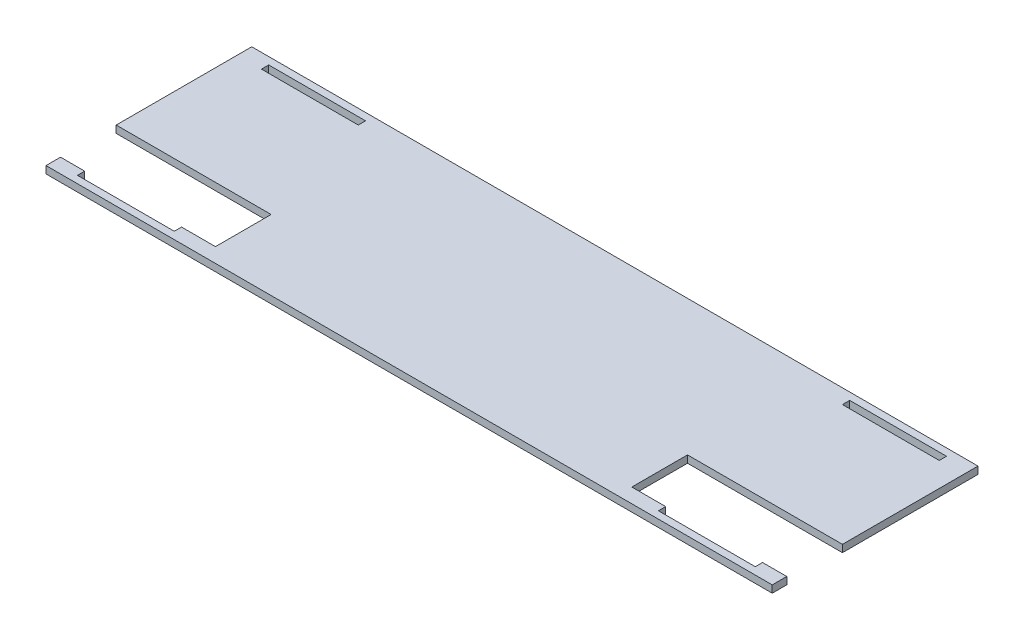
ISO-10303-21;
HEADER;
FILE_DESCRIPTION(('STEP AP214'),'2;1');
FILE_NAME('part.step','',(''),(''),'','','');
FILE_SCHEMA(('AUTOMOTIVE_DESIGN { 1 0 10303 214 1 1 1 1 }'));
ENDSEC;
DATA;
#1=APPLICATION_CONTEXT('core data for automotive mechanical design processes');
#2=APPLICATION_PROTOCOL_DEFINITION('international standard','automotive_design',2000,#1);
#3=PRODUCT_CONTEXT('',#1,'mechanical');
#4=PRODUCT('Part','Part','',(#3));
#5=PRODUCT_RELATED_PRODUCT_CATEGORY('part','',(#4));
#6=PRODUCT_DEFINITION_FORMATION('','',#4);
#7=PRODUCT_DEFINITION_CONTEXT('part definition',#1,'design');
#8=PRODUCT_DEFINITION('design','',#6,#7);
#9=PRODUCT_DEFINITION_SHAPE('','',#8);
#10=(LENGTH_UNIT() NAMED_UNIT(*) SI_UNIT(.MILLI.,.METRE.));
#11=(NAMED_UNIT(*) PLANE_ANGLE_UNIT() SI_UNIT($,.RADIAN.));
#12=(NAMED_UNIT(*) SI_UNIT($,.STERADIAN.) SOLID_ANGLE_UNIT());
#13=UNCERTAINTY_MEASURE_WITH_UNIT(LENGTH_MEASURE(1.E-05),#10,'distance_accuracy_value','');
#14=(GEOMETRIC_REPRESENTATION_CONTEXT(3) GLOBAL_UNCERTAINTY_ASSIGNED_CONTEXT((#13)) GLOBAL_UNIT_ASSIGNED_CONTEXT((#10,
#11,#12)) REPRESENTATION_CONTEXT('',''));
#15=CARTESIAN_POINT('',(0.,0.,0.));
#16=DIRECTION('',(0.,0.,1.));
#17=DIRECTION('',(1.,0.,0.));
#18=AXIS2_PLACEMENT_3D('',#15,#16,#17);
#19=CARTESIAN_POINT('',(0.,3.,0.));
#20=DIRECTION('',(-1.,0.,0.));
#21=DIRECTION('',(0.,0.,1.));
#22=AXIS2_PLACEMENT_3D('',#19,#20,#21);
#23=PLANE('',#22);
#24=DIRECTION('',(0.,0.,-1.));
#25=VECTOR('',#24,1.);
#26=CARTESIAN_POINT('',(0.,3.,0.));
#27=LINE('',#26,#25);
#28=CARTESIAN_POINT('',(0.,3.,-29.));
#29=VERTEX_POINT('',#28);
#30=CARTESIAN_POINT('',(0.,3.,-85.));
#31=VERTEX_POINT('',#30);
#32=EDGE_CURVE('E404',#29,#31,#27,.T.);
#33=ORIENTED_EDGE('',*,*,#32,.F.);
#34=DIRECTION('',(0.,1.,0.));
#35=VECTOR('',#34,1.);
#36=CARTESIAN_POINT('',(0.,0.,-29.));
#37=LINE('',#36,#35);
#38=CARTESIAN_POINT('',(0.,0.,-29.));
#39=VERTEX_POINT('',#38);
#40=EDGE_CURVE('E257',#39,#29,#37,.T.);
#41=ORIENTED_EDGE('',*,*,#40,.F.);
#42=DIRECTION('',(0.,0.,-1.));
#43=VECTOR('',#42,1.);
#44=CARTESIAN_POINT('',(0.,0.,0.));
#45=LINE('',#44,#43);
#46=CARTESIAN_POINT('',(0.,0.,-85.));
#47=VERTEX_POINT('',#46);
#48=EDGE_CURVE('E393',#39,#47,#45,.T.);
#49=ORIENTED_EDGE('',*,*,#48,.T.);
#50=DIRECTION('',(0.,-1.,0.));
#51=VECTOR('',#50,1.);
#52=CARTESIAN_POINT('',(0.,3.,-85.));
#53=LINE('',#52,#51);
#54=EDGE_CURVE('E11',#31,#47,#53,.T.);
#55=ORIENTED_EDGE('',*,*,#54,.F.);
#56=EDGE_LOOP('',(#33,#41,#49,#55));
#57=FACE_BOUND('',#56,.T.);
#58=ADVANCED_FACE('F33',(#57),#23,.F.);
#59=CARTESIAN_POINT('',(-300.,3.,0.));
#60=DIRECTION('',(1.,0.,0.));
#61=DIRECTION('',(0.,0.,-1.));
#62=AXIS2_PLACEMENT_3D('',#59,#60,#61);
#63=PLANE('',#62);
#64=DIRECTION('',(0.,0.,1.));
#65=VECTOR('',#64,1.);
#66=CARTESIAN_POINT('',(-300.,0.,0.));
#67=LINE('',#66,#65);
#68=CARTESIAN_POINT('',(-300.,0.,-85.));
#69=VERTEX_POINT('',#68);
#70=CARTESIAN_POINT('',(-300.,0.,-29.));
#71=VERTEX_POINT('',#70);
#72=EDGE_CURVE('E419',#69,#71,#67,.T.);
#73=ORIENTED_EDGE('',*,*,#72,.T.);
#74=DIRECTION('',(0.,1.,0.));
#75=VECTOR('',#74,1.);
#76=CARTESIAN_POINT('',(-300.,0.,-29.));
#77=LINE('',#76,#75);
#78=CARTESIAN_POINT('',(-300.,3.,-29.));
#79=VERTEX_POINT('',#78);
#80=EDGE_CURVE('E279',#71,#79,#77,.T.);
#81=ORIENTED_EDGE('',*,*,#80,.T.);
#82=DIRECTION('',(0.,0.,1.));
#83=VECTOR('',#82,1.);
#84=CARTESIAN_POINT('',(-300.,3.,0.));
#85=LINE('',#84,#83);
#86=CARTESIAN_POINT('',(-300.,3.,-85.));
#87=VERTEX_POINT('',#86);
#88=EDGE_CURVE('E407',#87,#79,#85,.T.);
#89=ORIENTED_EDGE('',*,*,#88,.F.);
#90=DIRECTION('',(0.,-1.,0.));
#91=VECTOR('',#90,1.);
#92=CARTESIAN_POINT('',(-300.,3.,-85.));
#93=LINE('',#92,#91);
#94=EDGE_CURVE('E41',#87,#69,#93,.T.);
#95=ORIENTED_EDGE('',*,*,#94,.T.);
#96=EDGE_LOOP('',(#73,#81,#89,#95));
#97=FACE_BOUND('',#96,.T.);
#98=ADVANCED_FACE('F433',(#97),#63,.F.);
#99=CARTESIAN_POINT('',(0.,0.,0.));
#100=VERTEX_POINT('',#99);
#101=CARTESIAN_POINT('',(0.,0.,-5.99999999999996));
#102=VERTEX_POINT('',#101);
#103=EDGE_CURVE('E413',#100,#102,#45,.T.);
#104=ORIENTED_EDGE('',*,*,#103,.T.);
#105=DIRECTION('',(0.,1.,0.));
#106=VECTOR('',#105,1.);
#107=CARTESIAN_POINT('',(0.,0.,-5.99999999999996));
#108=LINE('',#107,#106);
#109=CARTESIAN_POINT('',(0.,3.,-5.99999999999996));
#110=VERTEX_POINT('',#109);
#111=EDGE_CURVE('E228',#102,#110,#108,.T.);
#112=ORIENTED_EDGE('',*,*,#111,.T.);
#113=CARTESIAN_POINT('',(0.,3.,0.));
#114=VERTEX_POINT('',#113);
#115=EDGE_CURVE('E400',#114,#110,#27,.T.);
#116=ORIENTED_EDGE('',*,*,#115,.F.);
#117=DIRECTION('',(0.,-1.,0.));
#118=VECTOR('',#117,1.);
#119=CARTESIAN_POINT('',(0.,3.,0.));
#120=LINE('',#119,#118);
#121=EDGE_CURVE('E412',#114,#100,#120,.T.);
#122=ORIENTED_EDGE('',*,*,#121,.T.);
#123=EDGE_LOOP('',(#104,#112,#116,#122));
#124=FACE_BOUND('',#123,.T.);
#125=ADVANCED_FACE('F35',(#124),#23,.F.);
#126=CARTESIAN_POINT('',(0.,3.,-85.));
#127=DIRECTION('',(0.,0.,1.));
#128=DIRECTION('',(1.,0.,0.));
#129=AXIS2_PLACEMENT_3D('',#126,#127,#128);
#130=PLANE('',#129);
#131=DIRECTION('',(-1.,0.,0.));
#132=VECTOR('',#131,1.);
#133=CARTESIAN_POINT('',(0.,0.,-85.));
#134=LINE('',#133,#132);
#135=EDGE_CURVE('E416',#47,#69,#134,.T.);
#136=ORIENTED_EDGE('',*,*,#135,.T.);
#137=ORIENTED_EDGE('',*,*,#94,.F.);
#138=DIRECTION('',(-1.,0.,0.));
#139=VECTOR('',#138,1.);
#140=CARTESIAN_POINT('',(0.,3.,-85.));
#141=LINE('',#140,#139);
#142=EDGE_CURVE('E403',#31,#87,#141,.T.);
#143=ORIENTED_EDGE('',*,*,#142,.F.);
#144=ORIENTED_EDGE('',*,*,#54,.T.);
#145=EDGE_LOOP('',(#136,#137,#143,#144));
#146=FACE_BOUND('',#145,.T.);
#147=ADVANCED_FACE('F450',(#146),#130,.F.);
#148=CARTESIAN_POINT('',(-300.,3.,-5.99999999999996));
#149=VERTEX_POINT('',#148);
#150=CARTESIAN_POINT('',(-300.,3.,0.));
#151=VERTEX_POINT('',#150);
#152=EDGE_CURVE('E406',#149,#151,#85,.T.);
#153=ORIENTED_EDGE('',*,*,#152,.F.);
#154=DIRECTION('',(0.,1.,0.));
#155=VECTOR('',#154,1.);
#156=CARTESIAN_POINT('',(-300.,0.,-5.99999999999996));
#157=LINE('',#156,#155);
#158=CARTESIAN_POINT('',(-300.,0.,-5.99999999999996));
#159=VERTEX_POINT('',#158);
#160=EDGE_CURVE('E271',#159,#149,#157,.T.);
#161=ORIENTED_EDGE('',*,*,#160,.F.);
#162=CARTESIAN_POINT('',(-300.,0.,0.));
#163=VERTEX_POINT('',#162);
#164=EDGE_CURVE('E418',#159,#163,#67,.T.);
#165=ORIENTED_EDGE('',*,*,#164,.T.);
#166=DIRECTION('',(0.,-1.,0.));
#167=VECTOR('',#166,1.);
#168=CARTESIAN_POINT('',(-300.,3.,0.));
#169=LINE('',#168,#167);
#170=EDGE_CURVE('E426',#151,#163,#169,.T.);
#171=ORIENTED_EDGE('',*,*,#170,.F.);
#172=EDGE_LOOP('',(#153,#161,#165,#171));
#173=FACE_BOUND('',#172,.T.);
#174=ADVANCED_FACE('F482',(#173),#63,.F.);
#175=CARTESIAN_POINT('',(0.,3.,0.));
#176=DIRECTION('',(0.,0.,-1.));
#177=DIRECTION('',(-1.,0.,0.));
#178=AXIS2_PLACEMENT_3D('',#175,#176,#177);
#179=PLANE('',#178);
#180=DIRECTION('',(1.,0.,0.));
#181=VECTOR('',#180,1.);
#182=CARTESIAN_POINT('',(0.,0.,0.));
#183=LINE('',#182,#181);
#184=EDGE_CURVE('E422',#163,#100,#183,.T.);
#185=ORIENTED_EDGE('',*,*,#184,.T.);
#186=ORIENTED_EDGE('',*,*,#121,.F.);
#187=DIRECTION('',(1.,0.,0.));
#188=VECTOR('',#187,1.);
#189=CARTESIAN_POINT('',(0.,3.,0.));
#190=LINE('',#189,#188);
#191=EDGE_CURVE('E410',#151,#114,#190,.T.);
#192=ORIENTED_EDGE('',*,*,#191,.F.);
#193=ORIENTED_EDGE('',*,*,#170,.T.);
#194=EDGE_LOOP('',(#185,#186,#192,#193));
#195=FACE_BOUND('',#194,.T.);
#196=ADVANCED_FACE('F478',(#195),#179,.F.);
#197=CARTESIAN_POINT('',(0.,3.,0.));
#198=DIRECTION('',(0.,1.,0.));
#199=DIRECTION('',(0.,0.,1.));
#200=AXIS2_PLACEMENT_3D('',#197,#198,#199);
#201=PLANE('',#200);
#202=DIRECTION('',(-1.,0.,0.));
#203=VECTOR('',#202,1.);
#204=CARTESIAN_POINT('',(-64.,3.,-29.));
#205=LINE('',#204,#203);
#206=CARTESIAN_POINT('',(-64.,3.,-29.));
#207=VERTEX_POINT('',#206);
#208=EDGE_CURVE('E243',#29,#207,#205,.T.);
#209=ORIENTED_EDGE('',*,*,#208,.F.);
#210=ORIENTED_EDGE('',*,*,#32,.T.);
#211=ORIENTED_EDGE('',*,*,#142,.T.);
#212=ORIENTED_EDGE('',*,*,#88,.T.);
#213=DIRECTION('',(-1.,0.,0.));
#214=VECTOR('',#213,1.);
#215=CARTESIAN_POINT('',(-300.,3.,-29.));
#216=LINE('',#215,#214);
#217=CARTESIAN_POINT('',(-236.,3.,-29.));
#218=VERTEX_POINT('',#217);
#219=EDGE_CURVE('E277',#218,#79,#216,.T.);
#220=ORIENTED_EDGE('',*,*,#219,.F.);
#221=DIRECTION('',(0.,0.,-1.));
#222=VECTOR('',#221,1.);
#223=CARTESIAN_POINT('',(-236.,3.,-29.));
#224=LINE('',#223,#222);
#225=CARTESIAN_POINT('',(-236.,3.,-5.99999999999996));
#226=VERTEX_POINT('',#225);
#227=EDGE_CURVE('E274',#226,#218,#224,.T.);
#228=ORIENTED_EDGE('',*,*,#227,.F.);
#229=DIRECTION('',(1.,0.,0.));
#230=VECTOR('',#229,1.);
#231=CARTESIAN_POINT('',(-300.,3.,-5.99999999999996));
#232=LINE('',#231,#230);
#233=CARTESIAN_POINT('',(-250.,3.,-5.99999999999996));
#234=VERTEX_POINT('',#233);
#235=EDGE_CURVE('E256',#234,#226,#232,.T.);
#236=ORIENTED_EDGE('',*,*,#235,.F.);
#237=DIRECTION('',(0.,0.,-1.));
#238=VECTOR('',#237,1.);
#239=CARTESIAN_POINT('',(-250.,3.,-2.99999999999996));
#240=LINE('',#239,#238);
#241=CARTESIAN_POINT('',(-250.,3.,-2.99999999999996));
#242=VERTEX_POINT('',#241);
#243=EDGE_CURVE('E377',#242,#234,#240,.T.);
#244=ORIENTED_EDGE('',*,*,#243,.F.);
#245=DIRECTION('',(1.,0.,0.));
#246=VECTOR('',#245,1.);
#247=CARTESIAN_POINT('',(-290.,3.,-2.99999999999996));
#248=LINE('',#247,#246);
#249=CARTESIAN_POINT('',(-290.,3.,-2.99999999999996));
#250=VERTEX_POINT('',#249);
#251=EDGE_CURVE('E385',#250,#242,#248,.T.);
#252=ORIENTED_EDGE('',*,*,#251,.F.);
#253=DIRECTION('',(0.,0.,1.));
#254=VECTOR('',#253,1.);
#255=CARTESIAN_POINT('',(-290.,3.,-2.99999999999996));
#256=LINE('',#255,#254);
#257=CARTESIAN_POINT('',(-290.,3.,-5.99999999999996));
#258=VERTEX_POINT('',#257);
#259=EDGE_CURVE('E366',#258,#250,#256,.T.);
#260=ORIENTED_EDGE('',*,*,#259,.F.);
#261=EDGE_CURVE('E272',#149,#258,#232,.T.);
#262=ORIENTED_EDGE('',*,*,#261,.F.);
#263=ORIENTED_EDGE('',*,*,#152,.T.);
#264=ORIENTED_EDGE('',*,*,#191,.T.);
#265=ORIENTED_EDGE('',*,*,#115,.T.);
#266=DIRECTION('',(1.,0.,0.));
#267=VECTOR('',#266,1.);
#268=CARTESIAN_POINT('',(-64.,3.,-5.99999999999996));
#269=LINE('',#268,#267);
#270=CARTESIAN_POINT('',(-10.,3.,-5.99999999999996));
#271=VERTEX_POINT('',#270);
#272=EDGE_CURVE('E252',#271,#110,#269,.T.);
#273=ORIENTED_EDGE('',*,*,#272,.F.);
#274=DIRECTION('',(0.,0.,-1.));
#275=VECTOR('',#274,1.);
#276=CARTESIAN_POINT('',(-10.,3.,-5.99999999999996));
#277=LINE('',#276,#275);
#278=CARTESIAN_POINT('',(-10.,3.,-2.99999999999996));
#279=VERTEX_POINT('',#278);
#280=EDGE_CURVE('E352',#279,#271,#277,.T.);
#281=ORIENTED_EDGE('',*,*,#280,.F.);
#282=DIRECTION('',(1.,0.,0.));
#283=VECTOR('',#282,1.);
#284=CARTESIAN_POINT('',(-50.,3.,-2.99999999999995));
#285=LINE('',#284,#283);
#286=CARTESIAN_POINT('',(-50.,3.,-2.99999999999995));
#287=VERTEX_POINT('',#286);
#288=EDGE_CURVE('E360',#287,#279,#285,.T.);
#289=ORIENTED_EDGE('',*,*,#288,.F.);
#290=DIRECTION('',(0.,0.,1.));
#291=VECTOR('',#290,1.);
#292=CARTESIAN_POINT('',(-50.,3.,-5.99999999999995));
#293=LINE('',#292,#291);
#294=CARTESIAN_POINT('',(-50.,3.,-5.99999999999995));
#295=VERTEX_POINT('',#294);
#296=EDGE_CURVE('E342',#295,#287,#293,.T.);
#297=ORIENTED_EDGE('',*,*,#296,.F.);
#298=CARTESIAN_POINT('',(-64.,3.,-5.99999999999996));
#299=VERTEX_POINT('',#298);
#300=EDGE_CURVE('E247',#299,#295,#269,.T.);
#301=ORIENTED_EDGE('',*,*,#300,.F.);
#302=DIRECTION('',(0.,0.,1.));
#303=VECTOR('',#302,1.);
#304=CARTESIAN_POINT('',(-64.,3.,-5.99999999999996));
#305=LINE('',#304,#303);
#306=EDGE_CURVE('E225',#207,#299,#305,.T.);
#307=ORIENTED_EDGE('',*,*,#306,.F.);
#308=EDGE_LOOP('',(#209,#210,#211,#212,#220,#228,#236,#244,#252,#260,#262,#263,#264,#265,#273,
#281,#289,#297,#301,#307));
#309=FACE_BOUND('',#308,.T.);
#310=DIRECTION('',(0.,0.,1.));
#311=VECTOR('',#310,1.);
#312=CARTESIAN_POINT('',(-290.,3.,-82.));
#313=LINE('',#312,#311);
#314=CARTESIAN_POINT('',(-290.,3.,-82.));
#315=VERTEX_POINT('',#314);
#316=CARTESIAN_POINT('',(-290.,3.,-79.));
#317=VERTEX_POINT('',#316);
#318=EDGE_CURVE('E48',#315,#317,#313,.T.);
#319=ORIENTED_EDGE('',*,*,#318,.F.);
#320=DIRECTION('',(-1.,0.,0.));
#321=VECTOR('',#320,1.);
#322=CARTESIAN_POINT('',(-290.,3.,-82.));
#323=LINE('',#322,#321);
#324=CARTESIAN_POINT('',(-250.,3.,-82.));
#325=VERTEX_POINT('',#324);
#326=EDGE_CURVE('E292',#325,#315,#323,.T.);
#327=ORIENTED_EDGE('',*,*,#326,.F.);
#328=DIRECTION('',(0.,0.,-1.));
#329=VECTOR('',#328,1.);
#330=CARTESIAN_POINT('',(-250.,3.,-82.));
#331=LINE('',#330,#329);
#332=CARTESIAN_POINT('',(-250.,3.,-79.));
#333=VERTEX_POINT('',#332);
#334=EDGE_CURVE('E304',#333,#325,#331,.T.);
#335=ORIENTED_EDGE('',*,*,#334,.F.);
#336=DIRECTION('',(1.,0.,0.));
#337=VECTOR('',#336,1.);
#338=CARTESIAN_POINT('',(-290.,3.,-79.));
#339=LINE('',#338,#337);
#340=EDGE_CURVE('E301',#317,#333,#339,.T.);
#341=ORIENTED_EDGE('',*,*,#340,.F.);
#342=EDGE_LOOP('',(#319,#327,#335,#341));
#343=FACE_BOUND('',#342,.T.);
#344=DIRECTION('',(0.,0.,1.));
#345=VECTOR('',#344,1.);
#346=CARTESIAN_POINT('',(-50.,3.,-82.));
#347=LINE('',#346,#345);
#348=CARTESIAN_POINT('',(-50.,3.,-82.));
#349=VERTEX_POINT('',#348);
#350=CARTESIAN_POINT('',(-50.,3.,-79.));
#351=VERTEX_POINT('',#350);
#352=EDGE_CURVE('E311',#349,#351,#347,.T.);
#353=ORIENTED_EDGE('',*,*,#352,.F.);
#354=DIRECTION('',(-1.,0.,0.));
#355=VECTOR('',#354,1.);
#356=CARTESIAN_POINT('',(-50.,3.,-82.));
#357=LINE('',#356,#355);
#358=CARTESIAN_POINT('',(-10.,3.,-82.));
#359=VERTEX_POINT('',#358);
#360=EDGE_CURVE('E321',#359,#349,#357,.T.);
#361=ORIENTED_EDGE('',*,*,#360,.F.);
#362=DIRECTION('',(0.,0.,-1.));
#363=VECTOR('',#362,1.);
#364=CARTESIAN_POINT('',(-10.,3.,-82.));
#365=LINE('',#364,#363);
#366=CARTESIAN_POINT('',(-10.,3.,-79.));
#367=VERTEX_POINT('',#366);
#368=EDGE_CURVE('E335',#367,#359,#365,.T.);
#369=ORIENTED_EDGE('',*,*,#368,.F.);
#370=DIRECTION('',(1.,0.,0.));
#371=VECTOR('',#370,1.);
#372=CARTESIAN_POINT('',(-50.,3.,-79.));
#373=LINE('',#372,#371);
#374=EDGE_CURVE('E332',#351,#367,#373,.T.);
#375=ORIENTED_EDGE('',*,*,#374,.F.);
#376=EDGE_LOOP('',(#353,#361,#369,#375));
#377=FACE_BOUND('',#376,.T.);
#378=ADVANCED_FACE('F445',(#309,#343,#377),#201,.T.);
#379=CARTESIAN_POINT('',(0.,0.,0.));
#380=DIRECTION('',(0.,1.,0.));
#381=DIRECTION('',(0.,0.,1.));
#382=AXIS2_PLACEMENT_3D('',#379,#380,#381);
#383=PLANE('',#382);
#384=DIRECTION('',(-1.,0.,0.));
#385=VECTOR('',#384,1.);
#386=CARTESIAN_POINT('',(-290.,0.,-82.));
#387=LINE('',#386,#385);
#388=CARTESIAN_POINT('',(-250.,0.,-82.));
#389=VERTEX_POINT('',#388);
#390=CARTESIAN_POINT('',(-290.,0.,-82.));
#391=VERTEX_POINT('',#390);
#392=EDGE_CURVE('E296',#389,#391,#387,.T.);
#393=ORIENTED_EDGE('',*,*,#392,.T.);
#394=DIRECTION('',(0.,0.,1.));
#395=VECTOR('',#394,1.);
#396=CARTESIAN_POINT('',(-290.,0.,-82.));
#397=LINE('',#396,#395);
#398=CARTESIAN_POINT('',(-290.,0.,-79.));
#399=VERTEX_POINT('',#398);
#400=EDGE_CURVE('E288',#391,#399,#397,.T.);
#401=ORIENTED_EDGE('',*,*,#400,.T.);
#402=DIRECTION('',(1.,0.,0.));
#403=VECTOR('',#402,1.);
#404=CARTESIAN_POINT('',(-290.,0.,-79.));
#405=LINE('',#404,#403);
#406=CARTESIAN_POINT('',(-250.,0.,-79.));
#407=VERTEX_POINT('',#406);
#408=EDGE_CURVE('E291',#399,#407,#405,.T.);
#409=ORIENTED_EDGE('',*,*,#408,.T.);
#410=DIRECTION('',(0.,0.,-1.));
#411=VECTOR('',#410,1.);
#412=CARTESIAN_POINT('',(-250.,0.,-82.));
#413=LINE('',#412,#411);
#414=EDGE_CURVE('E56',#407,#389,#413,.T.);
#415=ORIENTED_EDGE('',*,*,#414,.T.);
#416=EDGE_LOOP('',(#393,#401,#409,#415));
#417=FACE_BOUND('',#416,.T.);
#418=DIRECTION('',(-1.,0.,0.));
#419=VECTOR('',#418,1.);
#420=CARTESIAN_POINT('',(-50.,0.,-82.));
#421=LINE('',#420,#419);
#422=CARTESIAN_POINT('',(-10.,0.,-82.));
#423=VERTEX_POINT('',#422);
#424=CARTESIAN_POINT('',(-50.,0.,-82.));
#425=VERTEX_POINT('',#424);
#426=EDGE_CURVE('E327',#423,#425,#421,.T.);
#427=ORIENTED_EDGE('',*,*,#426,.T.);
#428=DIRECTION('',(0.,0.,1.));
#429=VECTOR('',#428,1.);
#430=CARTESIAN_POINT('',(-50.,0.,-82.));
#431=LINE('',#430,#429);
#432=CARTESIAN_POINT('',(-50.,0.,-79.));
#433=VERTEX_POINT('',#432);
#434=EDGE_CURVE('E317',#425,#433,#431,.T.);
#435=ORIENTED_EDGE('',*,*,#434,.T.);
#436=DIRECTION('',(1.,0.,0.));
#437=VECTOR('',#436,1.);
#438=CARTESIAN_POINT('',(-50.,0.,-79.));
#439=LINE('',#438,#437);
#440=CARTESIAN_POINT('',(-10.,0.,-79.));
#441=VERTEX_POINT('',#440);
#442=EDGE_CURVE('E320',#433,#441,#439,.T.);
#443=ORIENTED_EDGE('',*,*,#442,.T.);
#444=DIRECTION('',(0.,0.,-1.));
#445=VECTOR('',#444,1.);
#446=CARTESIAN_POINT('',(-10.,0.,-82.));
#447=LINE('',#446,#445);
#448=EDGE_CURVE('E324',#441,#423,#447,.T.);
#449=ORIENTED_EDGE('',*,*,#448,.T.);
#450=EDGE_LOOP('',(#427,#435,#443,#449));
#451=FACE_BOUND('',#450,.T.);
#452=ORIENTED_EDGE('',*,*,#48,.F.);
#453=DIRECTION('',(-1.,0.,0.));
#454=VECTOR('',#453,1.);
#455=CARTESIAN_POINT('',(-64.,0.,-29.));
#456=LINE('',#455,#454);
#457=CARTESIAN_POINT('',(-64.,0.,-29.));
#458=VERTEX_POINT('',#457);
#459=EDGE_CURVE('E229',#39,#458,#456,.T.);
#460=ORIENTED_EDGE('',*,*,#459,.T.);
#461=DIRECTION('',(0.,0.,1.));
#462=VECTOR('',#461,1.);
#463=CARTESIAN_POINT('',(-64.,0.,-5.99999999999996));
#464=LINE('',#463,#462);
#465=CARTESIAN_POINT('',(-64.,0.,-5.99999999999996));
#466=VERTEX_POINT('',#465);
#467=EDGE_CURVE('E222',#458,#466,#464,.T.);
#468=ORIENTED_EDGE('',*,*,#467,.T.);
#469=DIRECTION('',(1.,0.,0.));
#470=VECTOR('',#469,1.);
#471=CARTESIAN_POINT('',(-64.,0.,-5.99999999999996));
#472=LINE('',#471,#470);
#473=CARTESIAN_POINT('',(-50.,0.,-5.99999999999996));
#474=VERTEX_POINT('',#473);
#475=EDGE_CURVE('E232',#466,#474,#472,.T.);
#476=ORIENTED_EDGE('',*,*,#475,.T.);
#477=DIRECTION('',(0.,0.,1.));
#478=VECTOR('',#477,1.);
#479=CARTESIAN_POINT('',(-50.,0.,-5.99999999999995));
#480=LINE('',#479,#478);
#481=CARTESIAN_POINT('',(-50.,0.,-2.99999999999995));
#482=VERTEX_POINT('',#481);
#483=EDGE_CURVE('E349',#474,#482,#480,.T.);
#484=ORIENTED_EDGE('',*,*,#483,.T.);
#485=DIRECTION('',(1.,0.,0.));
#486=VECTOR('',#485,1.);
#487=CARTESIAN_POINT('',(-50.,0.,-2.99999999999995));
#488=LINE('',#487,#486);
#489=CARTESIAN_POINT('',(-10.,0.,-2.99999999999996));
#490=VERTEX_POINT('',#489);
#491=EDGE_CURVE('E351',#482,#490,#488,.T.);
#492=ORIENTED_EDGE('',*,*,#491,.T.);
#493=DIRECTION('',(0.,0.,-1.));
#494=VECTOR('',#493,1.);
#495=CARTESIAN_POINT('',(-10.,0.,-5.99999999999996));
#496=LINE('',#495,#494);
#497=CARTESIAN_POINT('',(-10.,0.,-5.99999999999996));
#498=VERTEX_POINT('',#497);
#499=EDGE_CURVE('E355',#490,#498,#496,.T.);
#500=ORIENTED_EDGE('',*,*,#499,.T.);
#501=EDGE_CURVE('E239',#498,#102,#472,.T.);
#502=ORIENTED_EDGE('',*,*,#501,.T.);
#503=ORIENTED_EDGE('',*,*,#103,.F.);
#504=ORIENTED_EDGE('',*,*,#184,.F.);
#505=ORIENTED_EDGE('',*,*,#164,.F.);
#506=DIRECTION('',(1.,0.,0.));
#507=VECTOR('',#506,1.);
#508=CARTESIAN_POINT('',(-300.,0.,-5.99999999999996));
#509=LINE('',#508,#507);
#510=CARTESIAN_POINT('',(-290.,0.,-5.99999999999996));
#511=VERTEX_POINT('',#510);
#512=EDGE_CURVE('E261',#159,#511,#509,.T.);
#513=ORIENTED_EDGE('',*,*,#512,.T.);
#514=DIRECTION('',(0.,0.,1.));
#515=VECTOR('',#514,1.);
#516=CARTESIAN_POINT('',(-290.,0.,-2.99999999999996));
#517=LINE('',#516,#515);
#518=CARTESIAN_POINT('',(-290.,0.,-2.99999999999996));
#519=VERTEX_POINT('',#518);
#520=EDGE_CURVE('E373',#511,#519,#517,.T.);
#521=ORIENTED_EDGE('',*,*,#520,.T.);
#522=DIRECTION('',(1.,0.,0.));
#523=VECTOR('',#522,1.);
#524=CARTESIAN_POINT('',(-290.,0.,-2.99999999999996));
#525=LINE('',#524,#523);
#526=CARTESIAN_POINT('',(-250.,0.,-2.99999999999996));
#527=VERTEX_POINT('',#526);
#528=EDGE_CURVE('E376',#519,#527,#525,.T.);
#529=ORIENTED_EDGE('',*,*,#528,.T.);
#530=DIRECTION('',(0.,0.,-1.));
#531=VECTOR('',#530,1.);
#532=CARTESIAN_POINT('',(-250.,0.,-2.99999999999996));
#533=LINE('',#532,#531);
#534=CARTESIAN_POINT('',(-250.,0.,-5.99999999999996));
#535=VERTEX_POINT('',#534);
#536=EDGE_CURVE('E380',#527,#535,#533,.T.);
#537=ORIENTED_EDGE('',*,*,#536,.T.);
#538=CARTESIAN_POINT('',(-236.,0.,-5.99999999999996));
#539=VERTEX_POINT('',#538);
#540=EDGE_CURVE('E265',#535,#539,#509,.T.);
#541=ORIENTED_EDGE('',*,*,#540,.T.);
#542=DIRECTION('',(0.,0.,-1.));
#543=VECTOR('',#542,1.);
#544=CARTESIAN_POINT('',(-236.,0.,-29.));
#545=LINE('',#544,#543);
#546=CARTESIAN_POINT('',(-236.,0.,-29.));
#547=VERTEX_POINT('',#546);
#548=EDGE_CURVE('E264',#539,#547,#545,.T.);
#549=ORIENTED_EDGE('',*,*,#548,.T.);
#550=DIRECTION('',(-1.,0.,0.));
#551=VECTOR('',#550,1.);
#552=CARTESIAN_POINT('',(-300.,0.,-29.));
#553=LINE('',#552,#551);
#554=EDGE_CURVE('E268',#547,#71,#553,.T.);
#555=ORIENTED_EDGE('',*,*,#554,.T.);
#556=ORIENTED_EDGE('',*,*,#72,.F.);
#557=ORIENTED_EDGE('',*,*,#135,.F.);
#558=EDGE_LOOP('',(#452,#460,#468,#476,#484,#492,#500,#502,#503,#504,#505,#513,#521,#529,#537,
#541,#549,#555,#556,#557));
#559=FACE_BOUND('',#558,.T.);
#560=ADVANCED_FACE('F242',(#417,#451,#559),#383,.F.);
#561=CARTESIAN_POINT('',(-290.,0.,-2.99999999999996));
#562=DIRECTION('',(-1.,0.,0.));
#563=DIRECTION('',(0.,0.,1.));
#564=AXIS2_PLACEMENT_3D('',#561,#562,#563);
#565=PLANE('',#564);
#566=ORIENTED_EDGE('',*,*,#259,.T.);
#567=DIRECTION('',(0.,1.,0.));
#568=VECTOR('',#567,1.);
#569=CARTESIAN_POINT('',(-290.,0.,-2.99999999999996));
#570=LINE('',#569,#568);
#571=EDGE_CURVE('E383',#519,#250,#570,.T.);
#572=ORIENTED_EDGE('',*,*,#571,.F.);
#573=ORIENTED_EDGE('',*,*,#520,.F.);
#574=DIRECTION('',(0.,1.,0.));
#575=VECTOR('',#574,1.);
#576=CARTESIAN_POINT('',(-290.,0.,-5.99999999999996));
#577=LINE('',#576,#575);
#578=EDGE_CURVE('E390',#511,#258,#577,.T.);
#579=ORIENTED_EDGE('',*,*,#578,.T.);
#580=EDGE_LOOP('',(#566,#572,#573,#579));
#581=FACE_BOUND('',#580,.T.);
#582=ADVANCED_FACE('F491',(#581),#565,.F.);
#583=CARTESIAN_POINT('',(-250.,0.,-2.99999999999996));
#584=DIRECTION('',(1.,0.,0.));
#585=DIRECTION('',(0.,0.,-1.));
#586=AXIS2_PLACEMENT_3D('',#583,#584,#585);
#587=PLANE('',#586);
#588=ORIENTED_EDGE('',*,*,#243,.T.);
#589=DIRECTION('',(0.,1.,0.));
#590=VECTOR('',#589,1.);
#591=CARTESIAN_POINT('',(-250.,0.,-5.99999999999996));
#592=LINE('',#591,#590);
#593=EDGE_CURVE('E394',#535,#234,#592,.T.);
#594=ORIENTED_EDGE('',*,*,#593,.F.);
#595=ORIENTED_EDGE('',*,*,#536,.F.);
#596=DIRECTION('',(0.,1.,0.));
#597=VECTOR('',#596,1.);
#598=CARTESIAN_POINT('',(-250.,0.,-2.99999999999996));
#599=LINE('',#598,#597);
#600=EDGE_CURVE('E396',#527,#242,#599,.T.);
#601=ORIENTED_EDGE('',*,*,#600,.T.);
#602=EDGE_LOOP('',(#588,#594,#595,#601));
#603=FACE_BOUND('',#602,.T.);
#604=ADVANCED_FACE('F499',(#603),#587,.F.);
#605=CARTESIAN_POINT('',(-290.,0.,-2.99999999999996));
#606=DIRECTION('',(0.,0.,1.));
#607=DIRECTION('',(1.,0.,0.));
#608=AXIS2_PLACEMENT_3D('',#605,#606,#607);
#609=PLANE('',#608);
#610=ORIENTED_EDGE('',*,*,#251,.T.);
#611=ORIENTED_EDGE('',*,*,#600,.F.);
#612=ORIENTED_EDGE('',*,*,#528,.F.);
#613=ORIENTED_EDGE('',*,*,#571,.T.);
#614=EDGE_LOOP('',(#610,#611,#612,#613));
#615=FACE_BOUND('',#614,.T.);
#616=ADVANCED_FACE('F495',(#615),#609,.F.);
#617=CARTESIAN_POINT('',(-50.,0.,-5.99999999999995));
#618=DIRECTION('',(-1.,0.,0.));
#619=DIRECTION('',(0.,0.,1.));
#620=AXIS2_PLACEMENT_3D('',#617,#618,#619);
#621=PLANE('',#620);
#622=ORIENTED_EDGE('',*,*,#296,.T.);
#623=DIRECTION('',(0.,1.,0.));
#624=VECTOR('',#623,1.);
#625=CARTESIAN_POINT('',(-50.,0.,-2.99999999999995));
#626=LINE('',#625,#624);
#627=EDGE_CURVE('E358',#482,#287,#626,.T.);
#628=ORIENTED_EDGE('',*,*,#627,.F.);
#629=ORIENTED_EDGE('',*,*,#483,.F.);
#630=DIRECTION('',(0.,1.,0.));
#631=VECTOR('',#630,1.);
#632=CARTESIAN_POINT('',(-50.,0.,-5.99999999999995));
#633=LINE('',#632,#631);
#634=EDGE_CURVE('E235',#474,#295,#633,.T.);
#635=ORIENTED_EDGE('',*,*,#634,.T.);
#636=EDGE_LOOP('',(#622,#628,#629,#635));
#637=FACE_BOUND('',#636,.T.);
#638=ADVANCED_FACE('F458',(#637),#621,.F.);
#639=CARTESIAN_POINT('',(-10.,0.,-5.99999999999996));
#640=DIRECTION('',(1.,0.,0.));
#641=DIRECTION('',(0.,0.,-1.));
#642=AXIS2_PLACEMENT_3D('',#639,#640,#641);
#643=PLANE('',#642);
#644=ORIENTED_EDGE('',*,*,#280,.T.);
#645=DIRECTION('',(0.,1.,0.));
#646=VECTOR('',#645,1.);
#647=CARTESIAN_POINT('',(-10.,0.,-5.99999999999996));
#648=LINE('',#647,#646);
#649=EDGE_CURVE('E367',#498,#271,#648,.T.);
#650=ORIENTED_EDGE('',*,*,#649,.F.);
#651=ORIENTED_EDGE('',*,*,#499,.F.);
#652=DIRECTION('',(0.,1.,0.));
#653=VECTOR('',#652,1.);
#654=CARTESIAN_POINT('',(-10.,0.,-2.99999999999996));
#655=LINE('',#654,#653);
#656=EDGE_CURVE('E369',#490,#279,#655,.T.);
#657=ORIENTED_EDGE('',*,*,#656,.T.);
#658=EDGE_LOOP('',(#644,#650,#651,#657));
#659=FACE_BOUND('',#658,.T.);
#660=ADVANCED_FACE('F465',(#659),#643,.F.);
#661=CARTESIAN_POINT('',(-50.,0.,-2.99999999999995));
#662=DIRECTION('',(0.,0.,1.));
#663=DIRECTION('',(1.,0.,0.));
#664=AXIS2_PLACEMENT_3D('',#661,#662,#663);
#665=PLANE('',#664);
#666=ORIENTED_EDGE('',*,*,#288,.T.);
#667=ORIENTED_EDGE('',*,*,#656,.F.);
#668=ORIENTED_EDGE('',*,*,#491,.F.);
#669=ORIENTED_EDGE('',*,*,#627,.T.);
#670=EDGE_LOOP('',(#666,#667,#668,#669));
#671=FACE_BOUND('',#670,.T.);
#672=ADVANCED_FACE('F462',(#671),#665,.F.);
#673=CARTESIAN_POINT('',(-50.,0.,-82.));
#674=DIRECTION('',(-1.,0.,0.));
#675=DIRECTION('',(0.,0.,1.));
#676=AXIS2_PLACEMENT_3D('',#673,#674,#675);
#677=PLANE('',#676);
#678=ORIENTED_EDGE('',*,*,#352,.T.);
#679=DIRECTION('',(0.,1.,0.));
#680=VECTOR('',#679,1.);
#681=CARTESIAN_POINT('',(-50.,0.,-79.));
#682=LINE('',#681,#680);
#683=EDGE_CURVE('E330',#433,#351,#682,.T.);
#684=ORIENTED_EDGE('',*,*,#683,.F.);
#685=ORIENTED_EDGE('',*,*,#434,.F.);
#686=DIRECTION('',(0.,1.,0.));
#687=VECTOR('',#686,1.);
#688=CARTESIAN_POINT('',(-50.,0.,-82.));
#689=LINE('',#688,#687);
#690=EDGE_CURVE('E340',#425,#349,#689,.T.);
#691=ORIENTED_EDGE('',*,*,#690,.T.);
#692=EDGE_LOOP('',(#678,#684,#685,#691));
#693=FACE_BOUND('',#692,.T.);
#694=ADVANCED_FACE('F544',(#693),#677,.F.);
#695=CARTESIAN_POINT('',(-50.,0.,-82.));
#696=DIRECTION('',(0.,0.,-1.));
#697=DIRECTION('',(-1.,0.,0.));
#698=AXIS2_PLACEMENT_3D('',#695,#696,#697);
#699=PLANE('',#698);
#700=ORIENTED_EDGE('',*,*,#360,.T.);
#701=ORIENTED_EDGE('',*,*,#690,.F.);
#702=ORIENTED_EDGE('',*,*,#426,.F.);
#703=DIRECTION('',(0.,1.,0.));
#704=VECTOR('',#703,1.);
#705=CARTESIAN_POINT('',(-10.,0.,-82.));
#706=LINE('',#705,#704);
#707=EDGE_CURVE('E343',#423,#359,#706,.T.);
#708=ORIENTED_EDGE('',*,*,#707,.T.);
#709=EDGE_LOOP('',(#700,#701,#702,#708));
#710=FACE_BOUND('',#709,.T.);
#711=ADVANCED_FACE('F549',(#710),#699,.F.);
#712=CARTESIAN_POINT('',(-10.,0.,-82.));
#713=DIRECTION('',(1.,0.,0.));
#714=DIRECTION('',(0.,0.,-1.));
#715=AXIS2_PLACEMENT_3D('',#712,#713,#714);
#716=PLANE('',#715);
#717=ORIENTED_EDGE('',*,*,#368,.T.);
#718=ORIENTED_EDGE('',*,*,#707,.F.);
#719=ORIENTED_EDGE('',*,*,#448,.F.);
#720=DIRECTION('',(0.,1.,0.));
#721=VECTOR('',#720,1.);
#722=CARTESIAN_POINT('',(-10.,0.,-79.));
#723=LINE('',#722,#721);
#724=EDGE_CURVE('E345',#441,#367,#723,.T.);
#725=ORIENTED_EDGE('',*,*,#724,.T.);
#726=EDGE_LOOP('',(#717,#718,#719,#725));
#727=FACE_BOUND('',#726,.T.);
#728=ADVANCED_FACE('F555',(#727),#716,.F.);
#729=CARTESIAN_POINT('',(-50.,0.,-79.));
#730=DIRECTION('',(0.,0.,1.));
#731=DIRECTION('',(1.,0.,0.));
#732=AXIS2_PLACEMENT_3D('',#729,#730,#731);
#733=PLANE('',#732);
#734=ORIENTED_EDGE('',*,*,#374,.T.);
#735=ORIENTED_EDGE('',*,*,#724,.F.);
#736=ORIENTED_EDGE('',*,*,#442,.F.);
#737=ORIENTED_EDGE('',*,*,#683,.T.);
#738=EDGE_LOOP('',(#734,#735,#736,#737));
#739=FACE_BOUND('',#738,.T.);
#740=ADVANCED_FACE('F551',(#739),#733,.F.);
#741=CARTESIAN_POINT('',(-290.,0.,-82.));
#742=DIRECTION('',(-1.,0.,0.));
#743=DIRECTION('',(0.,0.,1.));
#744=AXIS2_PLACEMENT_3D('',#741,#742,#743);
#745=PLANE('',#744);
#746=ORIENTED_EDGE('',*,*,#318,.T.);
#747=DIRECTION('',(0.,1.,0.));
#748=VECTOR('',#747,1.);
#749=CARTESIAN_POINT('',(-290.,0.,-79.));
#750=LINE('',#749,#748);
#751=EDGE_CURVE('E299',#399,#317,#750,.T.);
#752=ORIENTED_EDGE('',*,*,#751,.F.);
#753=ORIENTED_EDGE('',*,*,#400,.F.);
#754=DIRECTION('',(0.,1.,0.));
#755=VECTOR('',#754,1.);
#756=CARTESIAN_POINT('',(-290.,0.,-82.));
#757=LINE('',#756,#755);
#758=EDGE_CURVE('E309',#391,#315,#757,.T.);
#759=ORIENTED_EDGE('',*,*,#758,.T.);
#760=EDGE_LOOP('',(#746,#752,#753,#759));
#761=FACE_BOUND('',#760,.T.);
#762=ADVANCED_FACE('F554',(#761),#745,.F.);
#763=CARTESIAN_POINT('',(-290.,0.,-82.));
#764=DIRECTION('',(0.,0.,-1.));
#765=DIRECTION('',(-1.,0.,0.));
#766=AXIS2_PLACEMENT_3D('',#763,#764,#765);
#767=PLANE('',#766);
#768=ORIENTED_EDGE('',*,*,#326,.T.);
#769=ORIENTED_EDGE('',*,*,#758,.F.);
#770=ORIENTED_EDGE('',*,*,#392,.F.);
#771=DIRECTION('',(0.,1.,0.));
#772=VECTOR('',#771,1.);
#773=CARTESIAN_POINT('',(-250.,0.,-82.));
#774=LINE('',#773,#772);
#775=EDGE_CURVE('E312',#389,#325,#774,.T.);
#776=ORIENTED_EDGE('',*,*,#775,.T.);
#777=EDGE_LOOP('',(#768,#769,#770,#776));
#778=FACE_BOUND('',#777,.T.);
#779=ADVANCED_FACE('F565',(#778),#767,.F.);
#780=CARTESIAN_POINT('',(-250.,0.,-82.));
#781=DIRECTION('',(1.,0.,0.));
#782=DIRECTION('',(0.,0.,-1.));
#783=AXIS2_PLACEMENT_3D('',#780,#781,#782);
#784=PLANE('',#783);
#785=ORIENTED_EDGE('',*,*,#334,.T.);
#786=ORIENTED_EDGE('',*,*,#775,.F.);
#787=ORIENTED_EDGE('',*,*,#414,.F.);
#788=DIRECTION('',(0.,1.,0.));
#789=VECTOR('',#788,1.);
#790=CARTESIAN_POINT('',(-250.,0.,-79.));
#791=LINE('',#790,#789);
#792=EDGE_CURVE('E314',#407,#333,#791,.T.);
#793=ORIENTED_EDGE('',*,*,#792,.T.);
#794=EDGE_LOOP('',(#785,#786,#787,#793));
#795=FACE_BOUND('',#794,.T.);
#796=ADVANCED_FACE('F568',(#795),#784,.F.);
#797=CARTESIAN_POINT('',(-290.,0.,-79.));
#798=DIRECTION('',(0.,0.,1.));
#799=DIRECTION('',(1.,0.,0.));
#800=AXIS2_PLACEMENT_3D('',#797,#798,#799);
#801=PLANE('',#800);
#802=ORIENTED_EDGE('',*,*,#340,.T.);
#803=ORIENTED_EDGE('',*,*,#792,.F.);
#804=ORIENTED_EDGE('',*,*,#408,.F.);
#805=ORIENTED_EDGE('',*,*,#751,.T.);
#806=EDGE_LOOP('',(#802,#803,#804,#805));
#807=FACE_BOUND('',#806,.T.);
#808=ADVANCED_FACE('F512',(#807),#801,.F.);
#809=CARTESIAN_POINT('',(-300.,0.,-5.99999999999996));
#810=DIRECTION('',(0.,0.,1.));
#811=DIRECTION('',(1.,0.,0.));
#812=AXIS2_PLACEMENT_3D('',#809,#810,#811);
#813=PLANE('',#812);
#814=ORIENTED_EDGE('',*,*,#235,.T.);
#815=DIRECTION('',(0.,1.,0.));
#816=VECTOR('',#815,1.);
#817=CARTESIAN_POINT('',(-236.,0.,-5.99999999999996));
#818=LINE('',#817,#816);
#819=EDGE_CURVE('E284',#539,#226,#818,.T.);
#820=ORIENTED_EDGE('',*,*,#819,.F.);
#821=ORIENTED_EDGE('',*,*,#540,.F.);
#822=ORIENTED_EDGE('',*,*,#593,.T.);
#823=EDGE_LOOP('',(#814,#820,#821,#822));
#824=FACE_BOUND('',#823,.T.);
#825=ADVANCED_FACE('F502',(#824),#813,.F.);
#826=CARTESIAN_POINT('',(-236.,0.,-29.));
#827=DIRECTION('',(1.,0.,0.));
#828=DIRECTION('',(0.,0.,-1.));
#829=AXIS2_PLACEMENT_3D('',#826,#827,#828);
#830=PLANE('',#829);
#831=ORIENTED_EDGE('',*,*,#227,.T.);
#832=DIRECTION('',(0.,1.,0.));
#833=VECTOR('',#832,1.);
#834=CARTESIAN_POINT('',(-236.,0.,-29.));
#835=LINE('',#834,#833);
#836=EDGE_CURVE('E282',#547,#218,#835,.T.);
#837=ORIENTED_EDGE('',*,*,#836,.F.);
#838=ORIENTED_EDGE('',*,*,#548,.F.);
#839=ORIENTED_EDGE('',*,*,#819,.T.);
#840=EDGE_LOOP('',(#831,#837,#838,#839));
#841=FACE_BOUND('',#840,.T.);
#842=ADVANCED_FACE('F504',(#841),#830,.F.);
#843=CARTESIAN_POINT('',(-300.,0.,-29.));
#844=DIRECTION('',(0.,0.,-1.));
#845=DIRECTION('',(-1.,0.,0.));
#846=AXIS2_PLACEMENT_3D('',#843,#844,#845);
#847=PLANE('',#846);
#848=ORIENTED_EDGE('',*,*,#219,.T.);
#849=ORIENTED_EDGE('',*,*,#80,.F.);
#850=ORIENTED_EDGE('',*,*,#554,.F.);
#851=ORIENTED_EDGE('',*,*,#836,.T.);
#852=EDGE_LOOP('',(#848,#849,#850,#851));
#853=FACE_BOUND('',#852,.T.);
#854=ADVANCED_FACE('F441',(#853),#847,.F.);
#855=ORIENTED_EDGE('',*,*,#512,.F.);
#856=ORIENTED_EDGE('',*,*,#160,.T.);
#857=ORIENTED_EDGE('',*,*,#261,.T.);
#858=ORIENTED_EDGE('',*,*,#578,.F.);
#859=EDGE_LOOP('',(#855,#856,#857,#858));
#860=FACE_BOUND('',#859,.T.);
#861=ADVANCED_FACE('F486',(#860),#813,.F.);
#862=CARTESIAN_POINT('',(-64.,0.,-5.99999999999996));
#863=DIRECTION('',(0.,0.,1.));
#864=DIRECTION('',(1.,0.,0.));
#865=AXIS2_PLACEMENT_3D('',#862,#863,#864);
#866=PLANE('',#865);
#867=ORIENTED_EDGE('',*,*,#272,.T.);
#868=ORIENTED_EDGE('',*,*,#111,.F.);
#869=ORIENTED_EDGE('',*,*,#501,.F.);
#870=ORIENTED_EDGE('',*,*,#649,.T.);
#871=EDGE_LOOP('',(#867,#868,#869,#870));
#872=FACE_BOUND('',#871,.T.);
#873=ADVANCED_FACE('F469',(#872),#866,.F.);
#874=ORIENTED_EDGE('',*,*,#475,.F.);
#875=DIRECTION('',(0.,1.,0.));
#876=VECTOR('',#875,1.);
#877=CARTESIAN_POINT('',(-64.,0.,-5.99999999999996));
#878=LINE('',#877,#876);
#879=EDGE_CURVE('E218',#466,#299,#878,.T.);
#880=ORIENTED_EDGE('',*,*,#879,.T.);
#881=ORIENTED_EDGE('',*,*,#300,.T.);
#882=ORIENTED_EDGE('',*,*,#634,.F.);
#883=EDGE_LOOP('',(#874,#880,#881,#882));
#884=FACE_BOUND('',#883,.T.);
#885=ADVANCED_FACE('F233',(#884),#866,.F.);
#886=CARTESIAN_POINT('',(-64.,0.,-5.99999999999996));
#887=DIRECTION('',(-1.,0.,0.));
#888=DIRECTION('',(0.,0.,1.));
#889=AXIS2_PLACEMENT_3D('',#886,#887,#888);
#890=PLANE('',#889);
#891=ORIENTED_EDGE('',*,*,#306,.T.);
#892=ORIENTED_EDGE('',*,*,#879,.F.);
#893=ORIENTED_EDGE('',*,*,#467,.F.);
#894=DIRECTION('',(0.,1.,0.));
#895=VECTOR('',#894,1.);
#896=CARTESIAN_POINT('',(-64.,0.,-29.));
#897=LINE('',#896,#895);
#898=EDGE_CURVE('E254',#458,#207,#897,.T.);
#899=ORIENTED_EDGE('',*,*,#898,.T.);
#900=EDGE_LOOP('',(#891,#892,#893,#899));
#901=FACE_BOUND('',#900,.T.);
#902=ADVANCED_FACE('F220',(#901),#890,.F.);
#903=CARTESIAN_POINT('',(-64.,0.,-29.));
#904=DIRECTION('',(0.,0.,-1.));
#905=DIRECTION('',(-1.,0.,0.));
#906=AXIS2_PLACEMENT_3D('',#903,#904,#905);
#907=PLANE('',#906);
#908=ORIENTED_EDGE('',*,*,#208,.T.);
#909=ORIENTED_EDGE('',*,*,#898,.F.);
#910=ORIENTED_EDGE('',*,*,#459,.F.);
#911=ORIENTED_EDGE('',*,*,#40,.T.);
#912=EDGE_LOOP('',(#908,#909,#910,#911));
#913=FACE_BOUND('',#912,.T.);
#914=ADVANCED_FACE('F454',(#913),#907,.F.);
#915=CLOSED_SHELL('',(#58,#98,#125,#147,#174,#196,#378,#560,#582,#604,#616,#638,#660,#672,#694,
#711,#728,#740,#762,#779,#796,#808,#825,#842,#854,#861,#873,#885,#902,#914));
#916=MANIFOLD_SOLID_BREP('B2',#915);
#917=ADVANCED_BREP_SHAPE_REPRESENTATION('',(#18,#916),#14);
#918=SHAPE_DEFINITION_REPRESENTATION(#9,#917);
ENDSEC;
END-ISO-10303-21;
